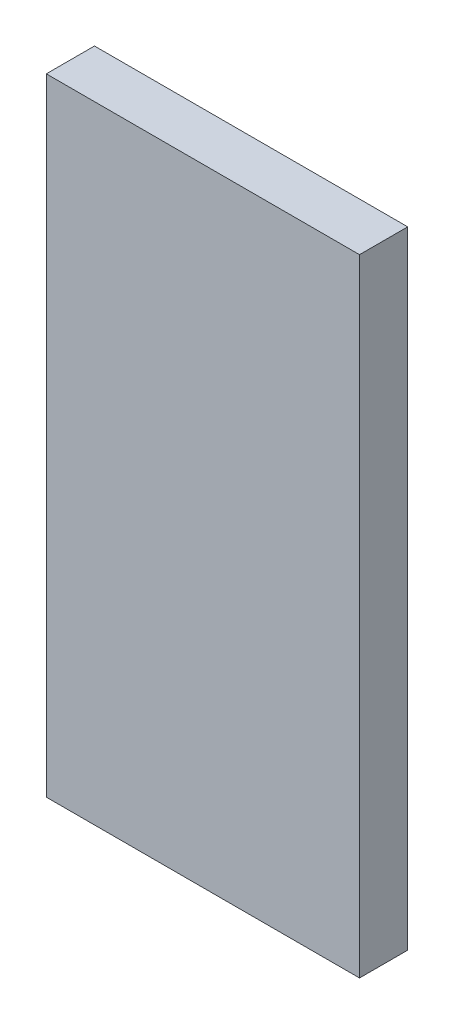
ISO-10303-21;
HEADER;
FILE_DESCRIPTION(('STEP AP214'),'2;1');
FILE_NAME('part.step','',(''),(''),'','','');
FILE_SCHEMA(('AUTOMOTIVE_DESIGN { 1 0 10303 214 1 1 1 1 }'));
ENDSEC;
DATA;
#1=APPLICATION_CONTEXT('core data for automotive mechanical design processes');
#2=APPLICATION_PROTOCOL_DEFINITION('international standard','automotive_design',2000,#1);
#3=PRODUCT_CONTEXT('',#1,'mechanical');
#4=PRODUCT('Part','Part','',(#3));
#5=PRODUCT_RELATED_PRODUCT_CATEGORY('part','',(#4));
#6=PRODUCT_DEFINITION_FORMATION('','',#4);
#7=PRODUCT_DEFINITION_CONTEXT('part definition',#1,'design');
#8=PRODUCT_DEFINITION('design','',#6,#7);
#9=PRODUCT_DEFINITION_SHAPE('','',#8);
#10=(LENGTH_UNIT() NAMED_UNIT(*) SI_UNIT(.MILLI.,.METRE.));
#11=(NAMED_UNIT(*) PLANE_ANGLE_UNIT() SI_UNIT($,.RADIAN.));
#12=(NAMED_UNIT(*) SI_UNIT($,.STERADIAN.) SOLID_ANGLE_UNIT());
#13=UNCERTAINTY_MEASURE_WITH_UNIT(LENGTH_MEASURE(1.E-05),#10,'distance_accuracy_value','');
#14=(GEOMETRIC_REPRESENTATION_CONTEXT(3) GLOBAL_UNCERTAINTY_ASSIGNED_CONTEXT((#13)) GLOBAL_UNIT_ASSIGNED_CONTEXT((#10,
#11,#12)) REPRESENTATION_CONTEXT('',''));
#15=CARTESIAN_POINT('',(0.,0.,0.));
#16=DIRECTION('',(0.,0.,1.));
#17=DIRECTION('',(1.,0.,0.));
#18=AXIS2_PLACEMENT_3D('',#15,#16,#17);
#19=CARTESIAN_POINT('',(41.275,-82.55,12.7));
#20=DIRECTION('',(-1.,0.,0.));
#21=DIRECTION('',(0.,0.,1.));
#22=AXIS2_PLACEMENT_3D('',#19,#20,#21);
#23=PLANE('',#22);
#24=DIRECTION('',(0.,1.,0.));
#25=VECTOR('',#24,1.);
#26=CARTESIAN_POINT('',(41.275,-82.55,0.));
#27=LINE('',#26,#25);
#28=CARTESIAN_POINT('',(41.275,-82.55,0.));
#29=VERTEX_POINT('',#28);
#30=CARTESIAN_POINT('',(41.275,82.55,0.));
#31=VERTEX_POINT('',#30);
#32=EDGE_CURVE('E94',#29,#31,#27,.T.);
#33=ORIENTED_EDGE('',*,*,#32,.T.);
#34=DIRECTION('',(0.,0.,-1.));
#35=VECTOR('',#34,1.);
#36=CARTESIAN_POINT('',(41.275,82.55,12.7));
#37=LINE('',#36,#35);
#38=CARTESIAN_POINT('',(41.275,82.55,12.7));
#39=VERTEX_POINT('',#38);
#40=EDGE_CURVE('E11',#39,#31,#37,.T.);
#41=ORIENTED_EDGE('',*,*,#40,.F.);
#42=DIRECTION('',(0.,1.,0.));
#43=VECTOR('',#42,1.);
#44=CARTESIAN_POINT('',(41.275,-82.55,12.7));
#45=LINE('',#44,#43);
#46=CARTESIAN_POINT('',(41.275,-82.55,12.7));
#47=VERTEX_POINT('',#46);
#48=EDGE_CURVE('E82',#47,#39,#45,.T.);
#49=ORIENTED_EDGE('',*,*,#48,.F.);
#50=DIRECTION('',(0.,0.,-1.));
#51=VECTOR('',#50,1.);
#52=CARTESIAN_POINT('',(41.275,-82.55,12.7));
#53=LINE('',#52,#51);
#54=EDGE_CURVE('E90',#47,#29,#53,.T.);
#55=ORIENTED_EDGE('',*,*,#54,.T.);
#56=EDGE_LOOP('',(#33,#41,#49,#55));
#57=FACE_BOUND('',#56,.T.);
#58=ADVANCED_FACE('F31',(#57),#23,.F.);
#59=CARTESIAN_POINT('',(-41.275,82.55,12.7));
#60=DIRECTION('',(0.,-1.,0.));
#61=DIRECTION('',(0.,0.,-1.));
#62=AXIS2_PLACEMENT_3D('',#59,#60,#61);
#63=PLANE('',#62);
#64=DIRECTION('',(-1.,0.,0.));
#65=VECTOR('',#64,1.);
#66=CARTESIAN_POINT('',(-41.275,82.55,0.));
#67=LINE('',#66,#65);
#68=CARTESIAN_POINT('',(-41.275,82.55,0.));
#69=VERTEX_POINT('',#68);
#70=EDGE_CURVE('E86',#31,#69,#67,.T.);
#71=ORIENTED_EDGE('',*,*,#70,.T.);
#72=DIRECTION('',(0.,0.,-1.));
#73=VECTOR('',#72,1.);
#74=CARTESIAN_POINT('',(-41.275,82.55,12.7));
#75=LINE('',#74,#73);
#76=CARTESIAN_POINT('',(-41.275,82.55,12.7));
#77=VERTEX_POINT('',#76);
#78=EDGE_CURVE('E39',#77,#69,#75,.T.);
#79=ORIENTED_EDGE('',*,*,#78,.F.);
#80=DIRECTION('',(-1.,0.,0.));
#81=VECTOR('',#80,1.);
#82=CARTESIAN_POINT('',(-41.275,82.55,12.7));
#83=LINE('',#82,#81);
#84=EDGE_CURVE('E77',#39,#77,#83,.T.);
#85=ORIENTED_EDGE('',*,*,#84,.F.);
#86=ORIENTED_EDGE('',*,*,#40,.T.);
#87=EDGE_LOOP('',(#71,#79,#85,#86));
#88=FACE_BOUND('',#87,.T.);
#89=ADVANCED_FACE('F85',(#88),#63,.F.);
#90=CARTESIAN_POINT('',(-41.275,-82.55,12.7));
#91=DIRECTION('',(1.,0.,0.));
#92=DIRECTION('',(0.,0.,-1.));
#93=AXIS2_PLACEMENT_3D('',#90,#91,#92);
#94=PLANE('',#93);
#95=DIRECTION('',(0.,-1.,0.));
#96=VECTOR('',#95,1.);
#97=CARTESIAN_POINT('',(-41.275,-82.55,0.));
#98=LINE('',#97,#96);
#99=CARTESIAN_POINT('',(-41.275,-82.55,0.));
#100=VERTEX_POINT('',#99);
#101=EDGE_CURVE('E64',#69,#100,#98,.T.);
#102=ORIENTED_EDGE('',*,*,#101,.T.);
#103=DIRECTION('',(0.,0.,-1.));
#104=VECTOR('',#103,1.);
#105=CARTESIAN_POINT('',(-41.275,-82.55,12.7));
#106=LINE('',#105,#104);
#107=CARTESIAN_POINT('',(-41.275,-82.55,12.7));
#108=VERTEX_POINT('',#107);
#109=EDGE_CURVE('E87',#108,#100,#106,.T.);
#110=ORIENTED_EDGE('',*,*,#109,.F.);
#111=DIRECTION('',(0.,-1.,0.));
#112=VECTOR('',#111,1.);
#113=CARTESIAN_POINT('',(-41.275,-82.55,12.7));
#114=LINE('',#113,#112);
#115=EDGE_CURVE('E80',#77,#108,#114,.T.);
#116=ORIENTED_EDGE('',*,*,#115,.F.);
#117=ORIENTED_EDGE('',*,*,#78,.T.);
#118=EDGE_LOOP('',(#102,#110,#116,#117));
#119=FACE_BOUND('',#118,.T.);
#120=ADVANCED_FACE('F88',(#119),#94,.F.);
#121=CARTESIAN_POINT('',(-41.275,-82.55,12.7));
#122=DIRECTION('',(0.,1.,0.));
#123=DIRECTION('',(0.,0.,1.));
#124=AXIS2_PLACEMENT_3D('',#121,#122,#123);
#125=PLANE('',#124);
#126=DIRECTION('',(1.,0.,0.));
#127=VECTOR('',#126,1.);
#128=CARTESIAN_POINT('',(-41.275,-82.55,0.));
#129=LINE('',#128,#127);
#130=EDGE_CURVE('E70',#100,#29,#129,.T.);
#131=ORIENTED_EDGE('',*,*,#130,.T.);
#132=ORIENTED_EDGE('',*,*,#54,.F.);
#133=DIRECTION('',(1.,0.,0.));
#134=VECTOR('',#133,1.);
#135=CARTESIAN_POINT('',(-41.275,-82.55,12.7));
#136=LINE('',#135,#134);
#137=EDGE_CURVE('E47',#108,#47,#136,.T.);
#138=ORIENTED_EDGE('',*,*,#137,.F.);
#139=ORIENTED_EDGE('',*,*,#109,.T.);
#140=EDGE_LOOP('',(#131,#132,#138,#139));
#141=FACE_BOUND('',#140,.T.);
#142=ADVANCED_FACE('F101',(#141),#125,.F.);
#143=CARTESIAN_POINT('',(41.275,82.55,12.7));
#144=DIRECTION('',(0.,0.,-1.));
#145=DIRECTION('',(-1.,0.,0.));
#146=AXIS2_PLACEMENT_3D('',#143,#144,#145);
#147=PLANE('',#146);
#148=ORIENTED_EDGE('',*,*,#48,.T.);
#149=ORIENTED_EDGE('',*,*,#84,.T.);
#150=ORIENTED_EDGE('',*,*,#115,.T.);
#151=ORIENTED_EDGE('',*,*,#137,.T.);
#152=EDGE_LOOP('',(#148,#149,#150,#151));
#153=FACE_BOUND('',#152,.T.);
#154=ADVANCED_FACE('F78',(#153),#147,.F.);
#155=CARTESIAN_POINT('',(41.275,82.55,0.));
#156=DIRECTION('',(0.,0.,-1.));
#157=DIRECTION('',(-1.,0.,0.));
#158=AXIS2_PLACEMENT_3D('',#155,#156,#157);
#159=PLANE('',#158);
#160=ORIENTED_EDGE('',*,*,#32,.F.);
#161=ORIENTED_EDGE('',*,*,#130,.F.);
#162=ORIENTED_EDGE('',*,*,#101,.F.);
#163=ORIENTED_EDGE('',*,*,#70,.F.);
#164=EDGE_LOOP('',(#160,#161,#162,#163));
#165=FACE_BOUND('',#164,.T.);
#166=ADVANCED_FACE('F104',(#165),#159,.T.);
#167=CLOSED_SHELL('',(#58,#89,#120,#142,#154,#166));
#168=MANIFOLD_SOLID_BREP('B2',#167);
#169=ADVANCED_BREP_SHAPE_REPRESENTATION('',(#18,#168),#14);
#170=SHAPE_DEFINITION_REPRESENTATION(#9,#169);
ENDSEC;
END-ISO-10303-21;
